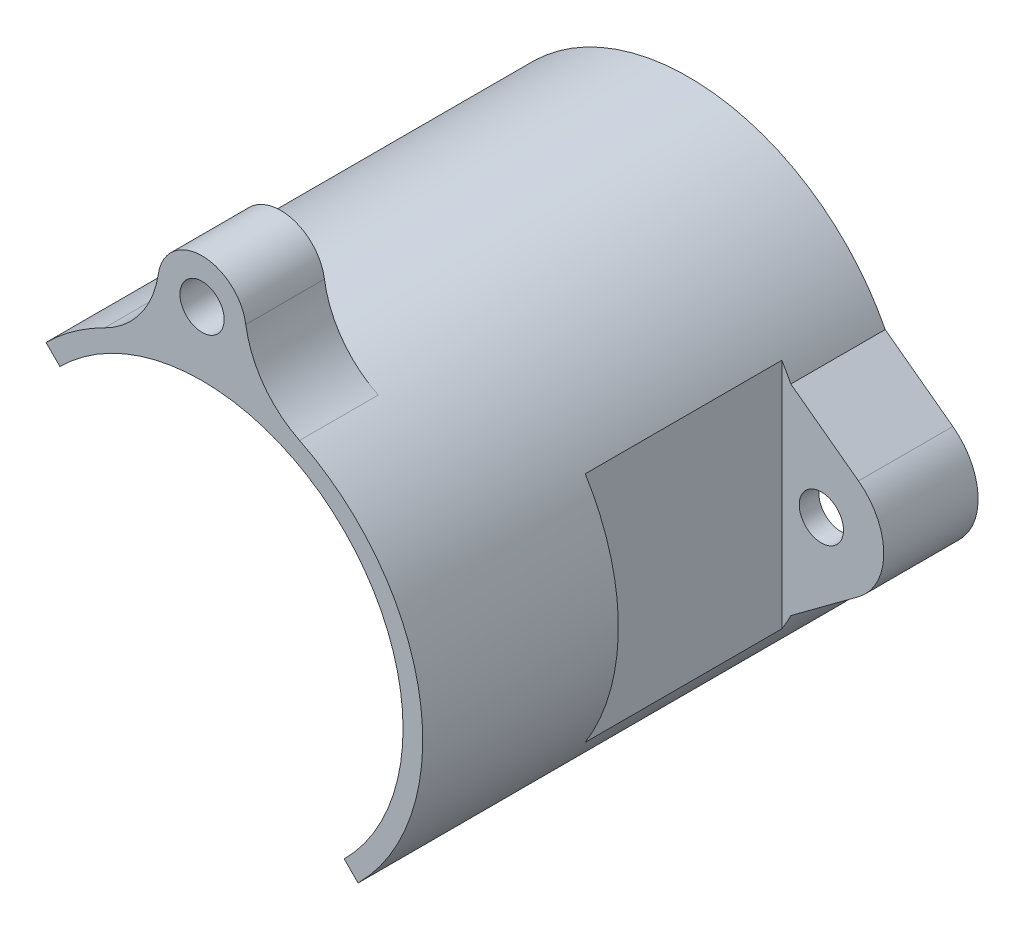
ISO-10303-21;
HEADER;
FILE_DESCRIPTION(('STEP AP214'),'2;1');
FILE_NAME('part.step','',(''),(''),'','','');
FILE_SCHEMA(('AUTOMOTIVE_DESIGN { 1 0 10303 214 1 1 1 1 }'));
ENDSEC;
DATA;
#1=APPLICATION_CONTEXT('core data for automotive mechanical design processes');
#2=APPLICATION_PROTOCOL_DEFINITION('international standard','automotive_design',2000,#1);
#3=PRODUCT_CONTEXT('',#1,'mechanical');
#4=PRODUCT('Part','Part','',(#3));
#5=PRODUCT_RELATED_PRODUCT_CATEGORY('part','',(#4));
#6=PRODUCT_DEFINITION_FORMATION('','',#4);
#7=PRODUCT_DEFINITION_CONTEXT('part definition',#1,'design');
#8=PRODUCT_DEFINITION('design','',#6,#7);
#9=PRODUCT_DEFINITION_SHAPE('','',#8);
#10=(LENGTH_UNIT() NAMED_UNIT(*) SI_UNIT(.MILLI.,.METRE.));
#11=(NAMED_UNIT(*) PLANE_ANGLE_UNIT() SI_UNIT($,.RADIAN.));
#12=(NAMED_UNIT(*) SI_UNIT($,.STERADIAN.) SOLID_ANGLE_UNIT());
#13=UNCERTAINTY_MEASURE_WITH_UNIT(LENGTH_MEASURE(1.E-05),#10,'distance_accuracy_value','');
#14=(GEOMETRIC_REPRESENTATION_CONTEXT(3) GLOBAL_UNCERTAINTY_ASSIGNED_CONTEXT((#13)) GLOBAL_UNIT_ASSIGNED_CONTEXT((#10,
#11,#12)) REPRESENTATION_CONTEXT('',''));
#15=CARTESIAN_POINT('',(0.,0.,0.));
#16=DIRECTION('',(0.,0.,1.));
#17=DIRECTION('',(1.,0.,0.));
#18=AXIS2_PLACEMENT_3D('',#15,#16,#17);
#19=CARTESIAN_POINT('',(0.,0.,0.));
#20=DIRECTION('',(-0.707106781186549,-0.707106781186546,0.));
#21=DIRECTION('',(0.707106781186546,-0.707106781186549,0.));
#22=AXIS2_PLACEMENT_3D('',#19,#20,#21);
#23=PLANE('',#22);
#24=DIRECTION('',(0.,0.,-1.));
#25=VECTOR('',#24,1.);
#26=CARTESIAN_POINT('',(-15.874547237638,15.874547237638,49.5));
#27=LINE('',#26,#25);
#28=CARTESIAN_POINT('',(-15.874547237638,15.874547237638,49.5));
#29=VERTEX_POINT('',#28);
#30=CARTESIAN_POINT('',(-15.874547237638,15.874547237638,0.));
#31=VERTEX_POINT('',#30);
#32=EDGE_CURVE('E210',#29,#31,#27,.T.);
#33=ORIENTED_EDGE('',*,*,#32,.T.);
#34=DIRECTION('',(0.707106781186546,-0.707106781186549,0.));
#35=VECTOR('',#34,1.);
#36=CARTESIAN_POINT('',(0.,0.,0.));
#37=LINE('',#36,#35);
#38=CARTESIAN_POINT('',(-14.4603336752649,14.4603336752649,0.));
#39=VERTEX_POINT('',#38);
#40=EDGE_CURVE('E191',#31,#39,#37,.T.);
#41=ORIENTED_EDGE('',*,*,#40,.T.);
#42=DIRECTION('',(0.,0.,-1.));
#43=VECTOR('',#42,1.);
#44=CARTESIAN_POINT('',(-14.4603336752649,14.4603336752649,49.5));
#45=LINE('',#44,#43);
#46=CARTESIAN_POINT('',(-14.4603336752649,14.4603336752649,49.5));
#47=VERTEX_POINT('',#46);
#48=EDGE_CURVE('E203',#47,#39,#45,.T.);
#49=ORIENTED_EDGE('',*,*,#48,.F.);
#50=DIRECTION('',(0.707106781186546,-0.707106781186549,0.));
#51=VECTOR('',#50,1.);
#52=CARTESIAN_POINT('',(0.,0.,49.5));
#53=LINE('',#52,#51);
#54=EDGE_CURVE('E298',#29,#47,#53,.T.);
#55=ORIENTED_EDGE('',*,*,#54,.F.);
#56=EDGE_LOOP('',(#33,#41,#49,#55));
#57=FACE_BOUND('',#56,.T.);
#58=ADVANCED_FACE('F40',(#57),#23,.T.);
#59=DIRECTION('',(0.,0.,-1.));
#60=VECTOR('',#59,1.);
#61=CARTESIAN_POINT('',(14.4603336752649,-14.4603336752649,49.5));
#62=LINE('',#61,#60);
#63=CARTESIAN_POINT('',(14.4603336752649,-14.4603336752649,0.));
#64=VERTEX_POINT('',#63);
#65=CARTESIAN_POINT('',(14.4603336752649,-14.4603336752649,49.5));
#66=VERTEX_POINT('',#65);
#67=EDGE_CURVE('E209',#64,#66,#62,.F.);
#68=ORIENTED_EDGE('',*,*,#67,.F.);
#69=CARTESIAN_POINT('',(15.874547237638,-15.874547237638,0.));
#70=VERTEX_POINT('',#69);
#71=EDGE_CURVE('E215',#64,#70,#37,.T.);
#72=ORIENTED_EDGE('',*,*,#71,.T.);
#73=DIRECTION('',(0.,0.,-1.));
#74=VECTOR('',#73,1.);
#75=CARTESIAN_POINT('',(15.874547237638,-15.874547237638,49.5));
#76=LINE('',#75,#74);
#77=CARTESIAN_POINT('',(15.874547237638,-15.874547237638,49.5));
#78=VERTEX_POINT('',#77);
#79=EDGE_CURVE('E214',#70,#78,#76,.F.);
#80=ORIENTED_EDGE('',*,*,#79,.T.);
#81=EDGE_CURVE('E295',#66,#78,#53,.T.);
#82=ORIENTED_EDGE('',*,*,#81,.F.);
#83=EDGE_LOOP('',(#68,#72,#80,#82));
#84=FACE_BOUND('',#83,.T.);
#85=ADVANCED_FACE('F379',(#84),#23,.T.);
#86=CARTESIAN_POINT('',(23.1,0.,9.6));
#87=DIRECTION('',(0.,0.,1.));
#88=DIRECTION('',(1.,0.,0.));
#89=AXIS2_PLACEMENT_3D('',#86,#87,#88);
#90=CYLINDRICAL_SURFACE('',#89,2.24999999999999);
#91=CARTESIAN_POINT('',(23.1,0.,9.6));
#92=DIRECTION('',(0.,0.,1.));
#93=DIRECTION('',(1.,0.,0.));
#94=AXIS2_PLACEMENT_3D('',#91,#92,#93);
#95=CIRCLE('',#94,2.24999999999999);
#96=CARTESIAN_POINT('',(25.35,0.,9.6));
#97=VERTEX_POINT('',#96);
#98=EDGE_CURVE('E245',#97,#97,#95,.T.);
#99=ORIENTED_EDGE('',*,*,#98,.T.);
#100=EDGE_LOOP('',(#99));
#101=FACE_BOUND('',#100,.T.);
#102=CARTESIAN_POINT('',(23.1,0.,7.6));
#103=DIRECTION('',(0.,0.,1.));
#104=DIRECTION('',(1.,0.,0.));
#105=AXIS2_PLACEMENT_3D('',#102,#103,#104);
#106=CIRCLE('',#105,2.24999999999999);
#107=CARTESIAN_POINT('',(25.35,0.,7.6));
#108=VERTEX_POINT('',#107);
#109=EDGE_CURVE('E249',#108,#108,#106,.T.);
#110=ORIENTED_EDGE('',*,*,#109,.F.);
#111=EDGE_LOOP('',(#110));
#112=FACE_BOUND('',#111,.T.);
#113=ADVANCED_FACE('F370',(#101,#112),#90,.F.);
#114=CARTESIAN_POINT('',(18.0802086799942,0.,29.6));
#115=DIRECTION('',(1.,0.,0.));
#116=DIRECTION('',(0.,1.,0.));
#117=AXIS2_PLACEMENT_3D('',#114,#115,#116);
#118=PLANE('',#117);
#119=DIRECTION('',(0.,-1.,0.));
#120=VECTOR('',#119,1.);
#121=CARTESIAN_POINT('',(18.0802086799942,0.,7.6));
#122=LINE('',#121,#120);
#123=CARTESIAN_POINT('',(18.0802086799942,9.13194781106274,7.6));
#124=VERTEX_POINT('',#123);
#125=CARTESIAN_POINT('',(18.0802086799942,-9.13194781106274,7.6));
#126=VERTEX_POINT('',#125);
#127=EDGE_CURVE('E273',#124,#126,#122,.T.);
#128=ORIENTED_EDGE('',*,*,#127,.T.);
#129=DIRECTION('',(0.,0.,-1.));
#130=VECTOR('',#129,1.);
#131=CARTESIAN_POINT('',(18.0802086799942,-9.13194781106274,29.6));
#132=LINE('',#131,#130);
#133=CARTESIAN_POINT('',(18.0802086799942,-9.13194781106274,31.6));
#134=VERTEX_POINT('',#133);
#135=EDGE_CURVE('E65',#134,#126,#132,.T.);
#136=ORIENTED_EDGE('',*,*,#135,.F.);
#137=DIRECTION('',(0.,1.,0.));
#138=VECTOR('',#137,1.);
#139=CARTESIAN_POINT('',(18.0802086799942,0.,31.6));
#140=LINE('',#139,#138);
#141=CARTESIAN_POINT('',(18.0802086799942,9.13194781106274,31.6));
#142=VERTEX_POINT('',#141);
#143=EDGE_CURVE('E283',#134,#142,#140,.T.);
#144=ORIENTED_EDGE('',*,*,#143,.T.);
#145=DIRECTION('',(0.,0.,-1.));
#146=VECTOR('',#145,1.);
#147=CARTESIAN_POINT('',(18.0802086799942,9.13194781106274,29.6));
#148=LINE('',#147,#146);
#149=EDGE_CURVE('E57',#142,#124,#148,.T.);
#150=ORIENTED_EDGE('',*,*,#149,.T.);
#151=EDGE_LOOP('',(#128,#136,#144,#150));
#152=FACE_BOUND('',#151,.T.);
#153=ADVANCED_FACE('F368',(#152),#118,.F.);
#154=CARTESIAN_POINT('',(0.,0.,7.6));
#155=DIRECTION('',(0.,0.,1.));
#156=DIRECTION('',(1.,0.,0.));
#157=AXIS2_PLACEMENT_3D('',#154,#155,#156);
#158=PLANE('',#157);
#159=ORIENTED_EDGE('',*,*,#109,.T.);
#160=EDGE_LOOP('',(#159));
#161=FACE_BOUND('',#160,.T.);
#162=CARTESIAN_POINT('',(23.1,0.,7.6));
#163=DIRECTION('',(0.,0.,1.));
#164=DIRECTION('',(1.,0.,0.));
#165=AXIS2_PLACEMENT_3D('',#162,#163,#164);
#166=CIRCLE('',#165,4.34999999999999);
#167=CARTESIAN_POINT('',(25.6892857142857,-3.49543981349928,7.6));
#168=VERTEX_POINT('',#167);
#169=CARTESIAN_POINT('',(25.6892857142857,3.49543981349929,7.6));
#170=VERTEX_POINT('',#169);
#171=EDGE_CURVE('E240',#168,#170,#166,.T.);
#172=ORIENTED_EDGE('',*,*,#171,.F.);
#173=DIRECTION('',(0.803549382413629,0.595238095238096,0.));
#174=VECTOR('',#173,1.);
#175=CARTESIAN_POINT('',(10.7738095238095,-14.5442438216867,7.6));
#176=LINE('',#175,#174);
#177=CARTESIAN_POINT('',(18.421999974947,-8.87876212785611,7.6));
#178=VERTEX_POINT('',#177);
#179=EDGE_CURVE('E243',#178,#168,#176,.T.);
#180=ORIENTED_EDGE('',*,*,#179,.F.);
#181=DIRECTION('',(0.803549382413629,0.595238095238095,0.));
#182=VECTOR('',#181,1.);
#183=CARTESIAN_POINT('',(10.7738095238095,-14.5442438216867,7.6));
#184=LINE('',#183,#182);
#185=EDGE_CURVE('E275',#126,#178,#184,.T.);
#186=ORIENTED_EDGE('',*,*,#185,.F.);
#187=ORIENTED_EDGE('',*,*,#127,.F.);
#188=DIRECTION('',(-0.803549382413629,0.595238095238095,0.));
#189=VECTOR('',#188,1.);
#190=CARTESIAN_POINT('',(10.7738095238095,14.5442438216867,7.6));
#191=LINE('',#190,#189);
#192=CARTESIAN_POINT('',(18.421999974947,8.87876212785612,7.6));
#193=VERTEX_POINT('',#192);
#194=EDGE_CURVE('E269',#193,#124,#191,.T.);
#195=ORIENTED_EDGE('',*,*,#194,.F.);
#196=DIRECTION('',(-0.803549382413629,0.595238095238095,0.));
#197=VECTOR('',#196,1.);
#198=CARTESIAN_POINT('',(10.7738095238095,14.5442438216867,7.6));
#199=LINE('',#198,#197);
#200=EDGE_CURVE('E237',#170,#193,#199,.T.);
#201=ORIENTED_EDGE('',*,*,#200,.F.);
#202=EDGE_LOOP('',(#172,#180,#186,#187,#195,#201));
#203=FACE_BOUND('',#202,.T.);
#204=ADVANCED_FACE('F367',(#161,#203),#158,.F.);
#205=CARTESIAN_POINT('',(0.,0.,29.6));
#206=DIRECTION('',(0.,0.,1.));
#207=DIRECTION('',(-1.,0.,0.));
#208=AXIS2_PLACEMENT_3D('',#205,#206,#207);
#209=PLANE('',#208);
#210=CARTESIAN_POINT('',(0.,0.,29.6));
#211=DIRECTION('',(0.,0.,1.));
#212=DIRECTION('',(1.,0.,0.));
#213=AXIS2_PLACEMENT_3D('',#210,#211,#212);
#214=CIRCLE('',#213,22.45);
#215=CARTESIAN_POINT('',(19.0802086799942,-11.8299677399337,29.6));
#216=VERTEX_POINT('',#215);
#217=CARTESIAN_POINT('',(19.0802086799942,11.8299677399337,29.6));
#218=VERTEX_POINT('',#217);
#219=EDGE_CURVE('E225',#216,#218,#214,.T.);
#220=ORIENTED_EDGE('',*,*,#219,.F.);
#221=DIRECTION('',(0.,-1.,0.));
#222=VECTOR('',#221,1.);
#223=CARTESIAN_POINT('',(19.0802086799942,0.,29.6));
#224=LINE('',#223,#222);
#225=EDGE_CURVE('E255',#218,#216,#224,.T.);
#226=ORIENTED_EDGE('',*,*,#225,.F.);
#227=EDGE_LOOP('',(#220,#226));
#228=FACE_BOUND('',#227,.T.);
#229=ADVANCED_FACE('F376',(#228),#209,.F.);
#230=CARTESIAN_POINT('',(19.0802086799942,0.,29.6));
#231=DIRECTION('',(1.,0.,0.));
#232=DIRECTION('',(0.,1.,0.));
#233=AXIS2_PLACEMENT_3D('',#230,#231,#232);
#234=PLANE('',#233);
#235=DIRECTION('',(0.,0.,-1.));
#236=VECTOR('',#235,1.);
#237=CARTESIAN_POINT('',(19.0802086799942,-11.8299677399337,29.6));
#238=LINE('',#237,#236);
#239=CARTESIAN_POINT('',(19.0802086799942,-11.8299677399337,9.6));
#240=VERTEX_POINT('',#239);
#241=EDGE_CURVE('E252',#216,#240,#238,.T.);
#242=ORIENTED_EDGE('',*,*,#241,.T.);
#243=DIRECTION('',(0.,-1.,0.));
#244=VECTOR('',#243,1.);
#245=CARTESIAN_POINT('',(19.0802086799942,0.,9.6));
#246=LINE('',#245,#244);
#247=CARTESIAN_POINT('',(19.0802086799942,11.8299677399337,9.6));
#248=VERTEX_POINT('',#247);
#249=EDGE_CURVE('E259',#248,#240,#246,.T.);
#250=ORIENTED_EDGE('',*,*,#249,.F.);
#251=DIRECTION('',(0.,0.,-1.));
#252=VECTOR('',#251,1.);
#253=CARTESIAN_POINT('',(19.0802086799942,11.8299677399337,29.6));
#254=LINE('',#253,#252);
#255=EDGE_CURVE('E248',#218,#248,#254,.T.);
#256=ORIENTED_EDGE('',*,*,#255,.F.);
#257=ORIENTED_EDGE('',*,*,#225,.T.);
#258=EDGE_LOOP('',(#242,#250,#256,#257));
#259=FACE_BOUND('',#258,.T.);
#260=ADVANCED_FACE('F474',(#259),#234,.T.);
#261=CARTESIAN_POINT('',(0.,0.,9.6));
#262=DIRECTION('',(0.,0.,1.));
#263=DIRECTION('',(1.,0.,0.));
#264=AXIS2_PLACEMENT_3D('',#261,#262,#263);
#265=PLANE('',#264);
#266=ORIENTED_EDGE('',*,*,#98,.F.);
#267=EDGE_LOOP('',(#266));
#268=FACE_BOUND('',#267,.T.);
#269=DIRECTION('',(-0.803549382413629,0.595238095238095,0.));
#270=VECTOR('',#269,1.);
#271=CARTESIAN_POINT('',(11.9642857142857,16.1513425865139,9.6));
#272=LINE('',#271,#270);
#273=CARTESIAN_POINT('',(26.8797619047619,5.10253857832654,9.6));
#274=VERTEX_POINT('',#273);
#275=CARTESIAN_POINT('',(19.9994782017534,10.1991848526041,9.6));
#276=VERTEX_POINT('',#275);
#277=EDGE_CURVE('E325',#274,#276,#272,.T.);
#278=ORIENTED_EDGE('',*,*,#277,.T.);
#279=CARTESIAN_POINT('',(0.,0.,9.6));
#280=DIRECTION('',(0.,0.,-1.));
#281=DIRECTION('',(-1.,0.,0.));
#282=AXIS2_PLACEMENT_3D('',#279,#280,#281);
#283=CIRCLE('',#282,22.45);
#284=EDGE_CURVE('E261',#248,#276,#283,.T.);
#285=ORIENTED_EDGE('',*,*,#284,.F.);
#286=ORIENTED_EDGE('',*,*,#249,.T.);
#287=CARTESIAN_POINT('',(0.,0.,9.6));
#288=DIRECTION('',(0.,0.,-1.));
#289=DIRECTION('',(-1.,0.,0.));
#290=AXIS2_PLACEMENT_3D('',#287,#288,#289);
#291=CIRCLE('',#290,22.45);
#292=CARTESIAN_POINT('',(19.9994782017534,-10.1991848526041,9.6));
#293=VERTEX_POINT('',#292);
#294=EDGE_CURVE('E256',#293,#240,#291,.T.);
#295=ORIENTED_EDGE('',*,*,#294,.F.);
#296=DIRECTION('',(0.803549382413629,0.595238095238096,0.));
#297=VECTOR('',#296,1.);
#298=CARTESIAN_POINT('',(11.9642857142857,-16.1513425865139,9.6));
#299=LINE('',#298,#297);
#300=CARTESIAN_POINT('',(26.8797619047619,-5.10253857832653,9.6));
#301=VERTEX_POINT('',#300);
#302=EDGE_CURVE('E317',#293,#301,#299,.T.);
#303=ORIENTED_EDGE('',*,*,#302,.T.);
#304=CARTESIAN_POINT('',(23.1,0.,9.6));
#305=DIRECTION('',(0.,0.,1.));
#306=DIRECTION('',(1.,0.,0.));
#307=AXIS2_PLACEMENT_3D('',#304,#305,#306);
#308=CIRCLE('',#307,6.34999999999999);
#309=EDGE_CURVE('E321',#301,#274,#308,.T.);
#310=ORIENTED_EDGE('',*,*,#309,.T.);
#311=EDGE_LOOP('',(#278,#285,#286,#295,#303,#310));
#312=FACE_BOUND('',#311,.T.);
#313=ADVANCED_FACE('F398',(#268,#312),#265,.T.);
#314=CARTESIAN_POINT('',(0.,0.,41.5));
#315=DIRECTION('',(0.,0.,1.));
#316=DIRECTION('',(1.,0.,0.));
#317=AXIS2_PLACEMENT_3D('',#314,#315,#316);
#318=PLANE('',#317);
#319=CARTESIAN_POINT('',(0.,26.95,41.5));
#320=DIRECTION('',(0.,0.,1.));
#321=DIRECTION('',(1.,0.,0.));
#322=AXIS2_PLACEMENT_3D('',#319,#320,#321);
#323=CIRCLE('',#322,2.24999999999999);
#324=CARTESIAN_POINT('',(2.25,26.95,41.5));
#325=VERTEX_POINT('',#324);
#326=EDGE_CURVE('E49',#325,#325,#323,.T.);
#327=ORIENTED_EDGE('',*,*,#326,.T.);
#328=EDGE_LOOP('',(#327));
#329=FACE_BOUND('',#328,.T.);
#330=CARTESIAN_POINT('',(0.,26.95,41.5));
#331=DIRECTION('',(0.,0.,1.));
#332=DIRECTION('',(1.,0.,0.));
#333=AXIS2_PLACEMENT_3D('',#330,#331,#332);
#334=CIRCLE('',#333,4.5);
#335=CARTESIAN_POINT('',(4.44976820577268,27.6204945301004,41.5));
#336=VERTEX_POINT('',#335);
#337=CARTESIAN_POINT('',(-4.44976820577267,27.6204945301004,41.5));
#338=VERTEX_POINT('',#337);
#339=EDGE_CURVE('E291',#336,#338,#334,.T.);
#340=ORIENTED_EDGE('',*,*,#339,.F.);
#341=CARTESIAN_POINT('',(14.3381419963786,29.1104823747681,41.5));
#342=DIRECTION('',(0.,0.,1.));
#343=DIRECTION('',(1.,0.,0.));
#344=AXIS2_PLACEMENT_3D('',#341,#342,#343);
#345=CIRCLE('',#344,10.);
#346=CARTESIAN_POINT('',(9.91960825327273,20.1396095320044,41.5));
#347=VERTEX_POINT('',#346);
#348=EDGE_CURVE('E297',#336,#347,#345,.T.);
#349=ORIENTED_EDGE('',*,*,#348,.T.);
#350=CARTESIAN_POINT('',(0.,0.,41.5));
#351=DIRECTION('',(0.,0.,1.));
#352=DIRECTION('',(1.,0.,0.));
#353=AXIS2_PLACEMENT_3D('',#350,#351,#352);
#354=CIRCLE('',#353,22.45);
#355=CARTESIAN_POINT('',(-9.91960825327273,20.1396095320044,41.5));
#356=VERTEX_POINT('',#355);
#357=EDGE_CURVE('E287',#347,#356,#354,.T.);
#358=ORIENTED_EDGE('',*,*,#357,.T.);
#359=CARTESIAN_POINT('',(-14.3381419963786,29.1104823747681,41.5));
#360=DIRECTION('',(0.,0.,1.));
#361=DIRECTION('',(1.,0.,0.));
#362=AXIS2_PLACEMENT_3D('',#359,#360,#361);
#363=CIRCLE('',#362,10.);
#364=EDGE_CURVE('E446',#356,#338,#363,.T.);
#365=ORIENTED_EDGE('',*,*,#364,.T.);
#366=EDGE_LOOP('',(#340,#349,#358,#365));
#367=FACE_BOUND('',#366,.T.);
#368=ADVANCED_FACE('F395',(#329,#367),#318,.F.);
#369=CARTESIAN_POINT('',(10.7738095238095,-14.5442438216867,29.6));
#370=DIRECTION('',(-0.595238095238095,0.803549382413629,0.));
#371=DIRECTION('',(-0.803549382413629,-0.595238095238095,0.));
#372=AXIS2_PLACEMENT_3D('',#369,#370,#371);
#373=PLANE('',#372);
#374=DIRECTION('',(0.,0.,-1.));
#375=VECTOR('',#374,1.);
#376=CARTESIAN_POINT('',(18.421999974947,-8.87876212785611,49.5));
#377=LINE('',#376,#375);
#378=CARTESIAN_POINT('',(18.421999974947,-8.87876212785611,31.6));
#379=VERTEX_POINT('',#378);
#380=EDGE_CURVE('E263',#379,#178,#377,.T.);
#381=ORIENTED_EDGE('',*,*,#380,.F.);
#382=DIRECTION('',(-0.803549382413629,-0.595238095238095,0.));
#383=VECTOR('',#382,1.);
#384=CARTESIAN_POINT('',(10.7738095238095,-14.5442438216867,31.6));
#385=LINE('',#384,#383);
#386=EDGE_CURVE('E280',#379,#134,#385,.T.);
#387=ORIENTED_EDGE('',*,*,#386,.T.);
#388=ORIENTED_EDGE('',*,*,#135,.T.);
#389=ORIENTED_EDGE('',*,*,#185,.T.);
#390=EDGE_LOOP('',(#381,#387,#388,#389));
#391=FACE_BOUND('',#390,.T.);
#392=ADVANCED_FACE('F363',(#391),#373,.F.);
#393=CARTESIAN_POINT('',(0.,0.,31.6));
#394=DIRECTION('',(0.,0.,1.));
#395=DIRECTION('',(-1.,0.,0.));
#396=AXIS2_PLACEMENT_3D('',#393,#394,#395);
#397=PLANE('',#396);
#398=DIRECTION('',(0.803549382413629,-0.595238095238095,0.));
#399=VECTOR('',#398,1.);
#400=CARTESIAN_POINT('',(10.7738095238095,14.5442438216867,31.6));
#401=LINE('',#400,#399);
#402=CARTESIAN_POINT('',(18.421999974947,8.87876212785612,31.6));
#403=VERTEX_POINT('',#402);
#404=EDGE_CURVE('E285',#142,#403,#401,.T.);
#405=ORIENTED_EDGE('',*,*,#404,.F.);
#406=ORIENTED_EDGE('',*,*,#143,.F.);
#407=ORIENTED_EDGE('',*,*,#386,.F.);
#408=CARTESIAN_POINT('',(0.,0.,31.6));
#409=DIRECTION('',(0.,0.,-1.));
#410=DIRECTION('',(-1.,0.,0.));
#411=AXIS2_PLACEMENT_3D('',#408,#409,#410);
#412=CIRCLE('',#411,20.45);
#413=EDGE_CURVE('E277',#403,#379,#412,.T.);
#414=ORIENTED_EDGE('',*,*,#413,.F.);
#415=EDGE_LOOP('',(#405,#406,#407,#414));
#416=FACE_BOUND('',#415,.T.);
#417=ADVANCED_FACE('F361',(#416),#397,.T.);
#418=CARTESIAN_POINT('',(10.7738095238095,14.5442438216867,29.6));
#419=DIRECTION('',(-0.595238095238095,-0.803549382413629,0.));
#420=DIRECTION('',(0.803549382413629,-0.595238095238095,0.));
#421=AXIS2_PLACEMENT_3D('',#418,#419,#420);
#422=PLANE('',#421);
#423=ORIENTED_EDGE('',*,*,#194,.T.);
#424=ORIENTED_EDGE('',*,*,#149,.F.);
#425=ORIENTED_EDGE('',*,*,#404,.T.);
#426=DIRECTION('',(0.,0.,-1.));
#427=VECTOR('',#426,1.);
#428=CARTESIAN_POINT('',(18.421999974947,8.87876212785612,29.6));
#429=LINE('',#428,#427);
#430=EDGE_CURVE('E267',#403,#193,#429,.T.);
#431=ORIENTED_EDGE('',*,*,#430,.T.);
#432=EDGE_LOOP('',(#423,#424,#425,#431));
#433=FACE_BOUND('',#432,.T.);
#434=ADVANCED_FACE('F359',(#433),#422,.F.);
#435=CARTESIAN_POINT('',(10.7738095238095,14.5442438216867,7.6));
#436=DIRECTION('',(-0.595238095238095,-0.803549382413629,0.));
#437=DIRECTION('',(0.803549382413629,-0.595238095238095,0.));
#438=AXIS2_PLACEMENT_3D('',#435,#436,#437);
#439=PLANE('',#438);
#440=DIRECTION('',(-0.803549382413629,0.595238095238095,0.));
#441=VECTOR('',#440,1.);
#442=CARTESIAN_POINT('',(10.7738095238095,14.5442438216867,0.));
#443=LINE('',#442,#441);
#444=CARTESIAN_POINT('',(25.6892857142857,3.49543981349929,0.));
#445=VERTEX_POINT('',#444);
#446=CARTESIAN_POINT('',(18.421999974947,8.87876212785611,0.));
#447=VERTEX_POINT('',#446);
#448=EDGE_CURVE('E194',#445,#447,#443,.T.);
#449=ORIENTED_EDGE('',*,*,#448,.F.);
#450=DIRECTION('',(0.,0.,-1.));
#451=VECTOR('',#450,1.);
#452=CARTESIAN_POINT('',(25.6892857142857,3.49543981349929,7.6));
#453=LINE('',#452,#451);
#454=EDGE_CURVE('E339',#170,#445,#453,.T.);
#455=ORIENTED_EDGE('',*,*,#454,.F.);
#456=ORIENTED_EDGE('',*,*,#200,.T.);
#457=DIRECTION('',(0.,0.,-1.));
#458=VECTOR('',#457,1.);
#459=CARTESIAN_POINT('',(18.421999974947,8.87876212785611,7.6));
#460=LINE('',#459,#458);
#461=EDGE_CURVE('E341',#193,#447,#460,.T.);
#462=ORIENTED_EDGE('',*,*,#461,.T.);
#463=EDGE_LOOP('',(#449,#455,#456,#462));
#464=FACE_BOUND('',#463,.T.);
#465=ADVANCED_FACE('F355',(#464),#439,.T.);
#466=CARTESIAN_POINT('',(23.1,0.,7.6));
#467=DIRECTION('',(0.,0.,-1.));
#468=DIRECTION('',(-1.,0.,0.));
#469=AXIS2_PLACEMENT_3D('',#466,#467,#468);
#470=CYLINDRICAL_SURFACE('',#469,4.34999999999999);
#471=CARTESIAN_POINT('',(23.1,0.,0.));
#472=DIRECTION('',(0.,0.,1.));
#473=DIRECTION('',(1.,0.,0.));
#474=AXIS2_PLACEMENT_3D('',#471,#472,#473);
#475=CIRCLE('',#474,4.34999999999999);
#476=CARTESIAN_POINT('',(25.6892857142857,-3.49543981349928,0.));
#477=VERTEX_POINT('',#476);
#478=EDGE_CURVE('E231',#477,#445,#475,.T.);
#479=ORIENTED_EDGE('',*,*,#478,.F.);
#480=DIRECTION('',(0.,0.,-1.));
#481=VECTOR('',#480,1.);
#482=CARTESIAN_POINT('',(25.6892857142857,-3.49543981349928,7.6));
#483=LINE('',#482,#481);
#484=EDGE_CURVE('E336',#168,#477,#483,.T.);
#485=ORIENTED_EDGE('',*,*,#484,.F.);
#486=ORIENTED_EDGE('',*,*,#171,.T.);
#487=ORIENTED_EDGE('',*,*,#454,.T.);
#488=EDGE_LOOP('',(#479,#485,#486,#487));
#489=FACE_BOUND('',#488,.T.);
#490=ADVANCED_FACE('F351',(#489),#470,.F.);
#491=CARTESIAN_POINT('',(10.7738095238095,-14.5442438216867,7.6));
#492=DIRECTION('',(-0.595238095238096,0.803549382413629,0.));
#493=DIRECTION('',(-0.803549382413629,-0.595238095238096,0.));
#494=AXIS2_PLACEMENT_3D('',#491,#492,#493);
#495=PLANE('',#494);
#496=DIRECTION('',(0.803549382413629,0.595238095238096,0.));
#497=VECTOR('',#496,1.);
#498=CARTESIAN_POINT('',(10.7738095238095,-14.5442438216867,0.));
#499=LINE('',#498,#497);
#500=CARTESIAN_POINT('',(18.421999974947,-8.87876212785611,0.));
#501=VERTEX_POINT('',#500);
#502=EDGE_CURVE('E227',#501,#477,#499,.T.);
#503=ORIENTED_EDGE('',*,*,#502,.F.);
#504=DIRECTION('',(0.,0.,-1.));
#505=VECTOR('',#504,1.);
#506=CARTESIAN_POINT('',(18.421999974947,-8.87876212785611,7.6));
#507=LINE('',#506,#505);
#508=EDGE_CURVE('E241',#178,#501,#507,.T.);
#509=ORIENTED_EDGE('',*,*,#508,.F.);
#510=ORIENTED_EDGE('',*,*,#179,.T.);
#511=ORIENTED_EDGE('',*,*,#484,.T.);
#512=EDGE_LOOP('',(#503,#509,#510,#511));
#513=FACE_BOUND('',#512,.T.);
#514=ADVANCED_FACE('F347',(#513),#495,.T.);
#515=CARTESIAN_POINT('',(11.9642857142857,-16.1513425865139,7.6));
#516=DIRECTION('',(-0.595238095238096,0.803549382413629,0.));
#517=DIRECTION('',(-0.803549382413629,-0.595238095238096,0.));
#518=AXIS2_PLACEMENT_3D('',#515,#516,#517);
#519=PLANE('',#518);
#520=DIRECTION('',(0.803549382413629,0.595238095238096,0.));
#521=VECTOR('',#520,1.);
#522=CARTESIAN_POINT('',(11.9642857142857,-16.1513425865139,0.));
#523=LINE('',#522,#521);
#524=CARTESIAN_POINT('',(19.9994782017534,-10.1991848526041,0.));
#525=VERTEX_POINT('',#524);
#526=CARTESIAN_POINT('',(26.8797619047619,-5.10253857832653,0.));
#527=VERTEX_POINT('',#526);
#528=EDGE_CURVE('E199',#525,#527,#523,.T.);
#529=ORIENTED_EDGE('',*,*,#528,.T.);
#530=DIRECTION('',(0.,0.,-1.));
#531=VECTOR('',#530,1.);
#532=CARTESIAN_POINT('',(26.8797619047619,-5.10253857832653,7.6));
#533=LINE('',#532,#531);
#534=EDGE_CURVE('E226',#301,#527,#533,.T.);
#535=ORIENTED_EDGE('',*,*,#534,.F.);
#536=ORIENTED_EDGE('',*,*,#302,.F.);
#537=DIRECTION('',(0.,0.,-1.));
#538=VECTOR('',#537,1.);
#539=CARTESIAN_POINT('',(19.9994782017534,-10.1991848526041,9.6));
#540=LINE('',#539,#538);
#541=EDGE_CURVE('E328',#293,#525,#540,.T.);
#542=ORIENTED_EDGE('',*,*,#541,.T.);
#543=EDGE_LOOP('',(#529,#535,#536,#542));
#544=FACE_BOUND('',#543,.T.);
#545=ADVANCED_FACE('F430',(#544),#519,.F.);
#546=CARTESIAN_POINT('',(23.1,0.,7.6));
#547=DIRECTION('',(0.,0.,-1.));
#548=DIRECTION('',(-1.,0.,0.));
#549=AXIS2_PLACEMENT_3D('',#546,#547,#548);
#550=CYLINDRICAL_SURFACE('',#549,6.34999999999999);
#551=CARTESIAN_POINT('',(23.1,0.,0.));
#552=DIRECTION('',(0.,0.,1.));
#553=DIRECTION('',(1.,0.,0.));
#554=AXIS2_PLACEMENT_3D('',#551,#552,#553);
#555=CIRCLE('',#554,6.34999999999999);
#556=CARTESIAN_POINT('',(26.8797619047619,5.10253857832654,0.));
#557=VERTEX_POINT('',#556);
#558=EDGE_CURVE('E313',#527,#557,#555,.T.);
#559=ORIENTED_EDGE('',*,*,#558,.T.);
#560=DIRECTION('',(0.,0.,1.));
#561=VECTOR('',#560,1.);
#562=CARTESIAN_POINT('',(26.8797619047619,5.10253857832654,7.6));
#563=LINE('',#562,#561);
#564=EDGE_CURVE('E330',#274,#557,#563,.F.);
#565=ORIENTED_EDGE('',*,*,#564,.F.);
#566=ORIENTED_EDGE('',*,*,#309,.F.);
#567=ORIENTED_EDGE('',*,*,#534,.T.);
#568=EDGE_LOOP('',(#559,#565,#566,#567));
#569=FACE_BOUND('',#568,.T.);
#570=ADVANCED_FACE('F469',(#569),#550,.T.);
#571=CARTESIAN_POINT('',(11.9642857142857,16.1513425865139,7.6));
#572=DIRECTION('',(-0.595238095238095,-0.803549382413629,0.));
#573=DIRECTION('',(0.803549382413629,-0.595238095238095,0.));
#574=AXIS2_PLACEMENT_3D('',#571,#572,#573);
#575=PLANE('',#574);
#576=DIRECTION('',(-0.803549382413629,0.595238095238095,0.));
#577=VECTOR('',#576,1.);
#578=CARTESIAN_POINT('',(11.9642857142857,16.1513425865139,0.));
#579=LINE('',#578,#577);
#580=CARTESIAN_POINT('',(19.9994782017534,10.1991848526041,0.));
#581=VERTEX_POINT('',#580);
#582=EDGE_CURVE('E311',#557,#581,#579,.T.);
#583=ORIENTED_EDGE('',*,*,#582,.T.);
#584=DIRECTION('',(0.,0.,-1.));
#585=VECTOR('',#584,1.);
#586=CARTESIAN_POINT('',(19.9994782017534,10.1991848526041,9.6));
#587=LINE('',#586,#585);
#588=EDGE_CURVE('E308',#276,#581,#587,.T.);
#589=ORIENTED_EDGE('',*,*,#588,.F.);
#590=ORIENTED_EDGE('',*,*,#277,.F.);
#591=ORIENTED_EDGE('',*,*,#564,.T.);
#592=EDGE_LOOP('',(#583,#589,#590,#591));
#593=FACE_BOUND('',#592,.T.);
#594=ADVANCED_FACE('F464',(#593),#575,.F.);
#595=CARTESIAN_POINT('',(-14.3381419963786,29.1104823747681,49.5));
#596=DIRECTION('',(0.,0.,-1.));
#597=DIRECTION('',(-1.,0.,0.));
#598=AXIS2_PLACEMENT_3D('',#595,#596,#597);
#599=CYLINDRICAL_SURFACE('',#598,10.);
#600=ORIENTED_EDGE('',*,*,#364,.F.);
#601=DIRECTION('',(0.,0.,-1.));
#602=VECTOR('',#601,1.);
#603=CARTESIAN_POINT('',(-9.91960825327272,20.1396095320044,49.5));
#604=LINE('',#603,#602);
#605=CARTESIAN_POINT('',(-9.91960825327273,20.1396095320044,49.5));
#606=VERTEX_POINT('',#605);
#607=EDGE_CURVE('E450',#606,#356,#604,.T.);
#608=ORIENTED_EDGE('',*,*,#607,.F.);
#609=CARTESIAN_POINT('',(-14.3381419963786,29.1104823747681,49.5));
#610=DIRECTION('',(0.,0.,1.));
#611=DIRECTION('',(1.,0.,0.));
#612=AXIS2_PLACEMENT_3D('',#609,#610,#611);
#613=CIRCLE('',#612,10.);
#614=CARTESIAN_POINT('',(-4.44976820577267,27.6204945301004,49.5));
#615=VERTEX_POINT('',#614);
#616=EDGE_CURVE('E453',#615,#606,#613,.F.);
#617=ORIENTED_EDGE('',*,*,#616,.F.);
#618=DIRECTION('',(0.,0.,1.));
#619=VECTOR('',#618,1.);
#620=CARTESIAN_POINT('',(-4.44976820577267,27.6204945301004,41.5));
#621=LINE('',#620,#619);
#622=EDGE_CURVE('E449',#338,#615,#621,.T.);
#623=ORIENTED_EDGE('',*,*,#622,.F.);
#624=EDGE_LOOP('',(#600,#608,#617,#623));
#625=FACE_BOUND('',#624,.T.);
#626=ADVANCED_FACE('F393',(#625),#599,.F.);
#627=CARTESIAN_POINT('',(0.,26.95,41.5));
#628=DIRECTION('',(0.,0.,1.));
#629=DIRECTION('',(1.,0.,0.));
#630=AXIS2_PLACEMENT_3D('',#627,#628,#629);
#631=CYLINDRICAL_SURFACE('',#630,4.5);
#632=ORIENTED_EDGE('',*,*,#339,.T.);
#633=ORIENTED_EDGE('',*,*,#622,.T.);
#634=CARTESIAN_POINT('',(0.,26.95,49.5));
#635=DIRECTION('',(0.,0.,1.));
#636=DIRECTION('',(1.,0.,0.));
#637=AXIS2_PLACEMENT_3D('',#634,#635,#636);
#638=CIRCLE('',#637,4.5);
#639=CARTESIAN_POINT('',(4.44976820577268,27.6204945301004,49.5));
#640=VERTEX_POINT('',#639);
#641=EDGE_CURVE('E288',#640,#615,#638,.T.);
#642=ORIENTED_EDGE('',*,*,#641,.F.);
#643=DIRECTION('',(0.,0.,1.));
#644=VECTOR('',#643,1.);
#645=CARTESIAN_POINT('',(4.44976820577268,27.6204945301004,41.5));
#646=LINE('',#645,#644);
#647=EDGE_CURVE('E423',#640,#336,#646,.F.);
#648=ORIENTED_EDGE('',*,*,#647,.T.);
#649=EDGE_LOOP('',(#632,#633,#642,#648));
#650=FACE_BOUND('',#649,.T.);
#651=ADVANCED_FACE('F389',(#650),#631,.T.);
#652=CARTESIAN_POINT('',(14.3381419963786,29.1104823747681,41.5));
#653=DIRECTION('',(0.,0.,-1.));
#654=DIRECTION('',(-1.,0.,0.));
#655=AXIS2_PLACEMENT_3D('',#652,#653,#654);
#656=CYLINDRICAL_SURFACE('',#655,10.);
#657=ORIENTED_EDGE('',*,*,#348,.F.);
#658=ORIENTED_EDGE('',*,*,#647,.F.);
#659=CARTESIAN_POINT('',(14.3381419963786,29.1104823747681,49.5));
#660=DIRECTION('',(0.,0.,1.));
#661=DIRECTION('',(1.,0.,0.));
#662=AXIS2_PLACEMENT_3D('',#659,#660,#661);
#663=CIRCLE('',#662,10.);
#664=CARTESIAN_POINT('',(9.91960825327273,20.1396095320044,49.5));
#665=VERTEX_POINT('',#664);
#666=EDGE_CURVE('E439',#665,#640,#663,.F.);
#667=ORIENTED_EDGE('',*,*,#666,.F.);
#668=DIRECTION('',(0.,0.,-1.));
#669=VECTOR('',#668,1.);
#670=CARTESIAN_POINT('',(9.91960825327273,20.1396095320044,49.5));
#671=LINE('',#670,#669);
#672=EDGE_CURVE('E445',#347,#665,#671,.F.);
#673=ORIENTED_EDGE('',*,*,#672,.F.);
#674=EDGE_LOOP('',(#657,#658,#667,#673));
#675=FACE_BOUND('',#674,.T.);
#676=ADVANCED_FACE('F392',(#675),#656,.F.);
#677=CARTESIAN_POINT('',(0.,0.,49.5));
#678=DIRECTION('',(0.,0.,-1.));
#679=DIRECTION('',(-1.,0.,0.));
#680=AXIS2_PLACEMENT_3D('',#677,#678,#679);
#681=CYLINDRICAL_SURFACE('',#680,20.45);
#682=CARTESIAN_POINT('',(0.,0.,49.5));
#683=DIRECTION('',(0.,0.,1.));
#684=DIRECTION('',(1.,0.,0.));
#685=AXIS2_PLACEMENT_3D('',#682,#683,#684);
#686=CIRCLE('',#685,20.45);
#687=EDGE_CURVE('E207',#66,#47,#686,.T.);
#688=ORIENTED_EDGE('',*,*,#687,.T.);
#689=ORIENTED_EDGE('',*,*,#48,.T.);
#690=CARTESIAN_POINT('',(0.,0.,0.));
#691=DIRECTION('',(0.,0.,1.));
#692=DIRECTION('',(1.,0.,0.));
#693=AXIS2_PLACEMENT_3D('',#690,#691,#692);
#694=CIRCLE('',#693,20.45);
#695=EDGE_CURVE('E187',#447,#39,#694,.T.);
#696=ORIENTED_EDGE('',*,*,#695,.F.);
#697=ORIENTED_EDGE('',*,*,#461,.F.);
#698=ORIENTED_EDGE('',*,*,#430,.F.);
#699=ORIENTED_EDGE('',*,*,#413,.T.);
#700=ORIENTED_EDGE('',*,*,#380,.T.);
#701=ORIENTED_EDGE('',*,*,#508,.T.);
#702=EDGE_CURVE('E198',#64,#501,#694,.T.);
#703=ORIENTED_EDGE('',*,*,#702,.F.);
#704=ORIENTED_EDGE('',*,*,#67,.T.);
#705=EDGE_LOOP('',(#688,#689,#696,#697,#698,#699,#700,#701,#703,#704));
#706=FACE_BOUND('',#705,.T.);
#707=ADVANCED_FACE('F204',(#706),#681,.F.);
#708=CARTESIAN_POINT('',(0.,0.,49.5));
#709=DIRECTION('',(0.,0.,-1.));
#710=DIRECTION('',(-1.,0.,0.));
#711=AXIS2_PLACEMENT_3D('',#708,#709,#710);
#712=CYLINDRICAL_SURFACE('',#711,22.45);
#713=ORIENTED_EDGE('',*,*,#32,.F.);
#714=CARTESIAN_POINT('',(0.,0.,49.5));
#715=DIRECTION('',(0.,0.,1.));
#716=DIRECTION('',(1.,0.,0.));
#717=AXIS2_PLACEMENT_3D('',#714,#715,#716);
#718=CIRCLE('',#717,22.45);
#719=EDGE_CURVE('E44',#606,#29,#718,.T.);
#720=ORIENTED_EDGE('',*,*,#719,.F.);
#721=ORIENTED_EDGE('',*,*,#607,.T.);
#722=ORIENTED_EDGE('',*,*,#357,.F.);
#723=ORIENTED_EDGE('',*,*,#672,.T.);
#724=EDGE_CURVE('E229',#78,#665,#718,.T.);
#725=ORIENTED_EDGE('',*,*,#724,.F.);
#726=ORIENTED_EDGE('',*,*,#79,.F.);
#727=CARTESIAN_POINT('',(0.,0.,0.));
#728=DIRECTION('',(0.,0.,1.));
#729=DIRECTION('',(1.,0.,0.));
#730=AXIS2_PLACEMENT_3D('',#727,#728,#729);
#731=CIRCLE('',#730,22.45);
#732=EDGE_CURVE('E224',#70,#525,#731,.T.);
#733=ORIENTED_EDGE('',*,*,#732,.T.);
#734=ORIENTED_EDGE('',*,*,#541,.F.);
#735=ORIENTED_EDGE('',*,*,#294,.T.);
#736=ORIENTED_EDGE('',*,*,#241,.F.);
#737=ORIENTED_EDGE('',*,*,#219,.T.);
#738=ORIENTED_EDGE('',*,*,#255,.T.);
#739=ORIENTED_EDGE('',*,*,#284,.T.);
#740=ORIENTED_EDGE('',*,*,#588,.T.);
#741=CARTESIAN_POINT('',(0.,0.,0.));
#742=DIRECTION('',(0.,0.,1.));
#743=DIRECTION('',(1.,0.,0.));
#744=AXIS2_PLACEMENT_3D('',#741,#742,#743);
#745=CIRCLE('',#744,22.45);
#746=EDGE_CURVE('E222',#581,#31,#745,.T.);
#747=ORIENTED_EDGE('',*,*,#746,.T.);
#748=EDGE_LOOP('',(#713,#720,#721,#722,#723,#725,#726,#733,#734,#735,#736,#737,#738,#739,#740,#747));
#749=FACE_BOUND('',#748,.T.);
#750=ADVANCED_FACE('F303',(#749),#712,.T.);
#751=CARTESIAN_POINT('',(0.,26.95,49.5));
#752=DIRECTION('',(0.,0.,1.));
#753=DIRECTION('',(1.,0.,0.));
#754=AXIS2_PLACEMENT_3D('',#751,#752,#753);
#755=CYLINDRICAL_SURFACE('',#754,2.24999999999999);
#756=CARTESIAN_POINT('',(0.,26.95,49.5));
#757=DIRECTION('',(0.,0.,1.));
#758=DIRECTION('',(1.,0.,0.));
#759=AXIS2_PLACEMENT_3D('',#756,#757,#758);
#760=CIRCLE('',#759,2.24999999999999);
#761=CARTESIAN_POINT('',(2.24999999999999,26.95,49.5));
#762=VERTEX_POINT('',#761);
#763=EDGE_CURVE('E11',#762,#762,#760,.T.);
#764=ORIENTED_EDGE('',*,*,#763,.T.);
#765=EDGE_LOOP('',(#764));
#766=FACE_BOUND('',#765,.T.);
#767=ORIENTED_EDGE('',*,*,#326,.F.);
#768=EDGE_LOOP('',(#767));
#769=FACE_BOUND('',#768,.T.);
#770=ADVANCED_FACE('F400',(#766,#769),#755,.F.);
#771=CARTESIAN_POINT('',(0.,0.,49.5));
#772=DIRECTION('',(0.,0.,1.));
#773=DIRECTION('',(1.,0.,0.));
#774=AXIS2_PLACEMENT_3D('',#771,#772,#773);
#775=PLANE('',#774);
#776=ORIENTED_EDGE('',*,*,#763,.F.);
#777=EDGE_LOOP('',(#776));
#778=FACE_BOUND('',#777,.T.);
#779=ORIENTED_EDGE('',*,*,#719,.T.);
#780=ORIENTED_EDGE('',*,*,#54,.T.);
#781=ORIENTED_EDGE('',*,*,#687,.F.);
#782=ORIENTED_EDGE('',*,*,#81,.T.);
#783=ORIENTED_EDGE('',*,*,#724,.T.);
#784=ORIENTED_EDGE('',*,*,#666,.T.);
#785=ORIENTED_EDGE('',*,*,#641,.T.);
#786=ORIENTED_EDGE('',*,*,#616,.T.);
#787=EDGE_LOOP('',(#779,#780,#781,#782,#783,#784,#785,#786));
#788=FACE_BOUND('',#787,.T.);
#789=ADVANCED_FACE('F42',(#778,#788),#775,.T.);
#790=CARTESIAN_POINT('',(0.,0.,0.));
#791=DIRECTION('',(0.,0.,1.));
#792=DIRECTION('',(1.,0.,0.));
#793=AXIS2_PLACEMENT_3D('',#790,#791,#792);
#794=PLANE('',#793);
#795=ORIENTED_EDGE('',*,*,#40,.F.);
#796=ORIENTED_EDGE('',*,*,#746,.F.);
#797=ORIENTED_EDGE('',*,*,#582,.F.);
#798=ORIENTED_EDGE('',*,*,#558,.F.);
#799=ORIENTED_EDGE('',*,*,#528,.F.);
#800=ORIENTED_EDGE('',*,*,#732,.F.);
#801=ORIENTED_EDGE('',*,*,#71,.F.);
#802=ORIENTED_EDGE('',*,*,#702,.T.);
#803=ORIENTED_EDGE('',*,*,#502,.T.);
#804=ORIENTED_EDGE('',*,*,#478,.T.);
#805=ORIENTED_EDGE('',*,*,#448,.T.);
#806=ORIENTED_EDGE('',*,*,#695,.T.);
#807=EDGE_LOOP('',(#795,#796,#797,#798,#799,#800,#801,#802,#803,#804,#805,#806));
#808=FACE_BOUND('',#807,.T.);
#809=ADVANCED_FACE('F189',(#808),#794,.F.);
#810=CLOSED_SHELL('',(#58,#85,#113,#153,#204,#229,#260,#313,#368,#392,#417,#434,#465,#490,#514,
#545,#570,#594,#626,#651,#676,#707,#750,#770,#789,#809));
#811=MANIFOLD_SOLID_BREP('B2',#810);
#812=ADVANCED_BREP_SHAPE_REPRESENTATION('',(#18,#811),#14);
#813=SHAPE_DEFINITION_REPRESENTATION(#9,#812);
ENDSEC;
END-ISO-10303-21;
